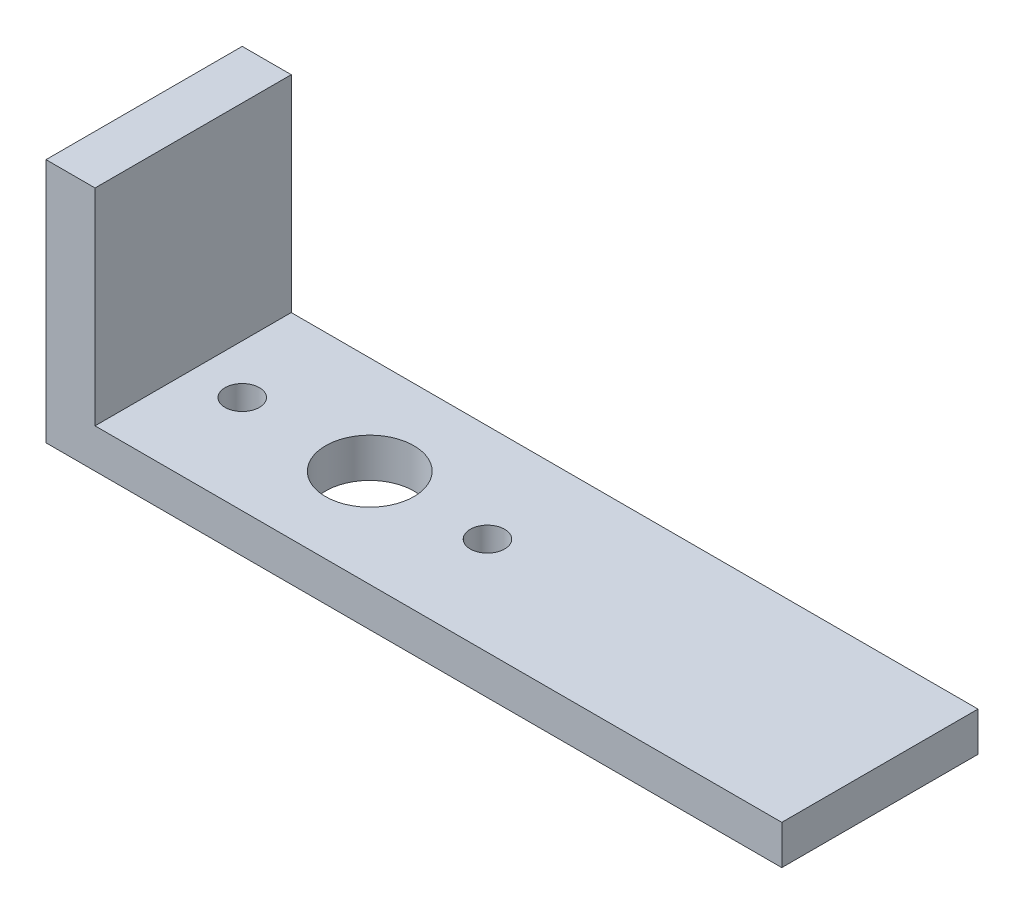
ISO-10303-21;
HEADER;
FILE_DESCRIPTION(('STEP AP214'),'2;1');
FILE_NAME('part.step','',(''),(''),'','','');
FILE_SCHEMA(('AUTOMOTIVE_DESIGN { 1 0 10303 214 1 1 1 1 }'));
ENDSEC;
DATA;
#1=APPLICATION_CONTEXT('core data for automotive mechanical design processes');
#2=APPLICATION_PROTOCOL_DEFINITION('international standard','automotive_design',2000,#1);
#3=PRODUCT_CONTEXT('',#1,'mechanical');
#4=PRODUCT('Part','Part','',(#3));
#5=PRODUCT_RELATED_PRODUCT_CATEGORY('part','',(#4));
#6=PRODUCT_DEFINITION_FORMATION('','',#4);
#7=PRODUCT_DEFINITION_CONTEXT('part definition',#1,'design');
#8=PRODUCT_DEFINITION('design','',#6,#7);
#9=PRODUCT_DEFINITION_SHAPE('','',#8);
#10=(LENGTH_UNIT() NAMED_UNIT(*) SI_UNIT(.MILLI.,.METRE.));
#11=(NAMED_UNIT(*) PLANE_ANGLE_UNIT() SI_UNIT($,.RADIAN.));
#12=(NAMED_UNIT(*) SI_UNIT($,.STERADIAN.) SOLID_ANGLE_UNIT());
#13=UNCERTAINTY_MEASURE_WITH_UNIT(LENGTH_MEASURE(1.E-05),#10,'distance_accuracy_value','');
#14=(GEOMETRIC_REPRESENTATION_CONTEXT(3) GLOBAL_UNCERTAINTY_ASSIGNED_CONTEXT((#13)) GLOBAL_UNIT_ASSIGNED_CONTEXT((#10,
#11,#12)) REPRESENTATION_CONTEXT('',''));
#15=CARTESIAN_POINT('',(0.,0.,0.));
#16=DIRECTION('',(0.,0.,1.));
#17=DIRECTION('',(1.,0.,0.));
#18=AXIS2_PLACEMENT_3D('',#15,#16,#17);
#19=CARTESIAN_POINT('',(0.,4.,-20.));
#20=DIRECTION('',(0.,0.,-1.));
#21=DIRECTION('',(-1.,0.,0.));
#22=AXIS2_PLACEMENT_3D('',#19,#20,#21);
#23=PLANE('',#22);
#24=DIRECTION('',(1.,0.,0.));
#25=VECTOR('',#24,1.);
#26=CARTESIAN_POINT('',(0.,0.,-20.));
#27=LINE('',#26,#25);
#28=CARTESIAN_POINT('',(0.,0.,-20.));
#29=VERTEX_POINT('',#28);
#30=CARTESIAN_POINT('',(75.,0.,-20.));
#31=VERTEX_POINT('',#30);
#32=EDGE_CURVE('E129',#29,#31,#27,.T.);
#33=ORIENTED_EDGE('',*,*,#32,.F.);
#34=DIRECTION('',(0.,-1.,0.));
#35=VECTOR('',#34,1.);
#36=CARTESIAN_POINT('',(0.,25.,-20.));
#37=LINE('',#36,#35);
#38=CARTESIAN_POINT('',(0.,25.,-20.));
#39=VERTEX_POINT('',#38);
#40=EDGE_CURVE('E204',#39,#29,#37,.T.);
#41=ORIENTED_EDGE('',*,*,#40,.F.);
#42=DIRECTION('',(1.,0.,0.));
#43=VECTOR('',#42,1.);
#44=CARTESIAN_POINT('',(0.,25.,-20.));
#45=LINE('',#44,#43);
#46=CARTESIAN_POINT('',(5.,25.,-20.));
#47=VERTEX_POINT('',#46);
#48=EDGE_CURVE('E200',#39,#47,#45,.T.);
#49=ORIENTED_EDGE('',*,*,#48,.T.);
#50=DIRECTION('',(0.,-1.,0.));
#51=VECTOR('',#50,1.);
#52=CARTESIAN_POINT('',(5.,25.,-20.));
#53=LINE('',#52,#51);
#54=CARTESIAN_POINT('',(5.,4.,-20.));
#55=VERTEX_POINT('',#54);
#56=EDGE_CURVE('E123',#47,#55,#53,.T.);
#57=ORIENTED_EDGE('',*,*,#56,.T.);
#58=DIRECTION('',(1.,0.,0.));
#59=VECTOR('',#58,1.);
#60=CARTESIAN_POINT('',(0.,4.,-20.));
#61=LINE('',#60,#59);
#62=CARTESIAN_POINT('',(75.,4.,-20.));
#63=VERTEX_POINT('',#62);
#64=EDGE_CURVE('E97',#55,#63,#61,.T.);
#65=ORIENTED_EDGE('',*,*,#64,.T.);
#66=DIRECTION('',(0.,-1.,0.));
#67=VECTOR('',#66,1.);
#68=CARTESIAN_POINT('',(75.,4.,-20.));
#69=LINE('',#68,#67);
#70=EDGE_CURVE('E47',#63,#31,#69,.T.);
#71=ORIENTED_EDGE('',*,*,#70,.T.);
#72=EDGE_LOOP('',(#33,#41,#49,#57,#65,#71));
#73=FACE_BOUND('',#72,.T.);
#74=ADVANCED_FACE('F37',(#73),#23,.T.);
#75=CARTESIAN_POINT('',(0.,4.,0.));
#76=DIRECTION('',(0.,0.,1.));
#77=DIRECTION('',(1.,0.,0.));
#78=AXIS2_PLACEMENT_3D('',#75,#76,#77);
#79=PLANE('',#78);
#80=DIRECTION('',(-1.,0.,0.));
#81=VECTOR('',#80,1.);
#82=CARTESIAN_POINT('',(0.,0.,0.));
#83=LINE('',#82,#81);
#84=CARTESIAN_POINT('',(75.,0.,0.));
#85=VERTEX_POINT('',#84);
#86=CARTESIAN_POINT('',(0.,0.,0.));
#87=VERTEX_POINT('',#86);
#88=EDGE_CURVE('E132',#85,#87,#83,.T.);
#89=ORIENTED_EDGE('',*,*,#88,.F.);
#90=DIRECTION('',(0.,-1.,0.));
#91=VECTOR('',#90,1.);
#92=CARTESIAN_POINT('',(75.,4.,0.));
#93=LINE('',#92,#91);
#94=CARTESIAN_POINT('',(75.,4.,0.));
#95=VERTEX_POINT('',#94);
#96=EDGE_CURVE('E11',#95,#85,#93,.T.);
#97=ORIENTED_EDGE('',*,*,#96,.F.);
#98=DIRECTION('',(-1.,0.,0.));
#99=VECTOR('',#98,1.);
#100=CARTESIAN_POINT('',(0.,4.,0.));
#101=LINE('',#100,#99);
#102=CARTESIAN_POINT('',(5.,4.,0.));
#103=VERTEX_POINT('',#102);
#104=EDGE_CURVE('E96',#95,#103,#101,.T.);
#105=ORIENTED_EDGE('',*,*,#104,.T.);
#106=DIRECTION('',(0.,-1.,0.));
#107=VECTOR('',#106,1.);
#108=CARTESIAN_POINT('',(5.,25.,0.));
#109=LINE('',#108,#107);
#110=CARTESIAN_POINT('',(5.,25.,0.));
#111=VERTEX_POINT('',#110);
#112=EDGE_CURVE('E80',#111,#103,#109,.T.);
#113=ORIENTED_EDGE('',*,*,#112,.F.);
#114=DIRECTION('',(-1.,0.,0.));
#115=VECTOR('',#114,1.);
#116=CARTESIAN_POINT('',(0.,25.,0.));
#117=LINE('',#116,#115);
#118=CARTESIAN_POINT('',(0.,25.,0.));
#119=VERTEX_POINT('',#118);
#120=EDGE_CURVE('E89',#111,#119,#117,.T.);
#121=ORIENTED_EDGE('',*,*,#120,.T.);
#122=DIRECTION('',(0.,-1.,0.));
#123=VECTOR('',#122,1.);
#124=CARTESIAN_POINT('',(0.,25.,0.));
#125=LINE('',#124,#123);
#126=EDGE_CURVE('E88',#119,#87,#125,.T.);
#127=ORIENTED_EDGE('',*,*,#126,.T.);
#128=EDGE_LOOP('',(#89,#97,#105,#113,#121,#127));
#129=FACE_BOUND('',#128,.T.);
#130=ADVANCED_FACE('F99',(#129),#79,.T.);
#131=CARTESIAN_POINT('',(10.,4.,-10.));
#132=DIRECTION('',(0.,-1.,0.));
#133=DIRECTION('',(0.,0.,-1.));
#134=AXIS2_PLACEMENT_3D('',#131,#132,#133);
#135=CYLINDRICAL_SURFACE('',#134,1.75);
#136=CARTESIAN_POINT('',(10.,4.,-10.));
#137=DIRECTION('',(0.,1.,0.));
#138=DIRECTION('',(0.,0.,1.));
#139=AXIS2_PLACEMENT_3D('',#136,#137,#138);
#140=CIRCLE('',#139,1.75);
#141=CARTESIAN_POINT('',(10.,4.,-8.25));
#142=VERTEX_POINT('',#141);
#143=EDGE_CURVE('E106',#142,#142,#140,.T.);
#144=ORIENTED_EDGE('',*,*,#143,.T.);
#145=EDGE_LOOP('',(#144));
#146=FACE_BOUND('',#145,.T.);
#147=CARTESIAN_POINT('',(10.,0.,-10.));
#148=DIRECTION('',(0.,1.,0.));
#149=DIRECTION('',(0.,0.,1.));
#150=AXIS2_PLACEMENT_3D('',#147,#148,#149);
#151=CIRCLE('',#150,1.75);
#152=CARTESIAN_POINT('',(10.,0.,-8.25));
#153=VERTEX_POINT('',#152);
#154=EDGE_CURVE('E126',#153,#153,#151,.T.);
#155=ORIENTED_EDGE('',*,*,#154,.F.);
#156=EDGE_LOOP('',(#155));
#157=FACE_BOUND('',#156,.T.);
#158=ADVANCED_FACE('F165',(#146,#157),#135,.F.);
#159=CARTESIAN_POINT('',(35.,4.,-10.));
#160=DIRECTION('',(0.,-1.,0.));
#161=DIRECTION('',(0.,0.,-1.));
#162=AXIS2_PLACEMENT_3D('',#159,#160,#161);
#163=CYLINDRICAL_SURFACE('',#162,1.75);
#164=CARTESIAN_POINT('',(35.,4.,-10.));
#165=DIRECTION('',(0.,1.,0.));
#166=DIRECTION('',(0.,0.,1.));
#167=AXIS2_PLACEMENT_3D('',#164,#165,#166);
#168=CIRCLE('',#167,1.75);
#169=CARTESIAN_POINT('',(35.,4.,-8.25));
#170=VERTEX_POINT('',#169);
#171=EDGE_CURVE('E109',#170,#170,#168,.T.);
#172=ORIENTED_EDGE('',*,*,#171,.T.);
#173=EDGE_LOOP('',(#172));
#174=FACE_BOUND('',#173,.T.);
#175=CARTESIAN_POINT('',(35.,0.,-10.));
#176=DIRECTION('',(0.,1.,0.));
#177=DIRECTION('',(0.,0.,1.));
#178=AXIS2_PLACEMENT_3D('',#175,#176,#177);
#179=CIRCLE('',#178,1.75);
#180=CARTESIAN_POINT('',(35.,0.,-8.25));
#181=VERTEX_POINT('',#180);
#182=EDGE_CURVE('E122',#181,#181,#179,.T.);
#183=ORIENTED_EDGE('',*,*,#182,.F.);
#184=EDGE_LOOP('',(#183));
#185=FACE_BOUND('',#184,.T.);
#186=ADVANCED_FACE('F156',(#174,#185),#163,.F.);
#187=CARTESIAN_POINT('',(23.,4.,-10.));
#188=DIRECTION('',(0.,-1.,0.));
#189=DIRECTION('',(0.,0.,-1.));
#190=AXIS2_PLACEMENT_3D('',#187,#188,#189);
#191=CYLINDRICAL_SURFACE('',#190,4.5);
#192=CARTESIAN_POINT('',(23.,4.,-10.));
#193=DIRECTION('',(0.,1.,0.));
#194=DIRECTION('',(0.,0.,1.));
#195=AXIS2_PLACEMENT_3D('',#192,#193,#194);
#196=CIRCLE('',#195,4.5);
#197=CARTESIAN_POINT('',(23.,4.,-5.5));
#198=VERTEX_POINT('',#197);
#199=EDGE_CURVE('E114',#198,#198,#196,.T.);
#200=ORIENTED_EDGE('',*,*,#199,.T.);
#201=EDGE_LOOP('',(#200));
#202=FACE_BOUND('',#201,.T.);
#203=CARTESIAN_POINT('',(23.,0.,-10.));
#204=DIRECTION('',(0.,1.,0.));
#205=DIRECTION('',(0.,0.,1.));
#206=AXIS2_PLACEMENT_3D('',#203,#204,#205);
#207=CIRCLE('',#206,4.5);
#208=CARTESIAN_POINT('',(23.,0.,-5.5));
#209=VERTEX_POINT('',#208);
#210=EDGE_CURVE('E119',#209,#209,#207,.T.);
#211=ORIENTED_EDGE('',*,*,#210,.F.);
#212=EDGE_LOOP('',(#211));
#213=FACE_BOUND('',#212,.T.);
#214=ADVANCED_FACE('F39',(#202,#213),#191,.F.);
#215=CARTESIAN_POINT('',(75.,4.,0.));
#216=DIRECTION('',(1.,0.,0.));
#217=DIRECTION('',(0.,0.,-1.));
#218=AXIS2_PLACEMENT_3D('',#215,#216,#217);
#219=PLANE('',#218);
#220=DIRECTION('',(0.,0.,1.));
#221=VECTOR('',#220,1.);
#222=CARTESIAN_POINT('',(75.,0.,0.));
#223=LINE('',#222,#221);
#224=EDGE_CURVE('E135',#31,#85,#223,.T.);
#225=ORIENTED_EDGE('',*,*,#224,.F.);
#226=ORIENTED_EDGE('',*,*,#70,.F.);
#227=DIRECTION('',(0.,0.,1.));
#228=VECTOR('',#227,1.);
#229=CARTESIAN_POINT('',(75.,4.,0.));
#230=LINE('',#229,#228);
#231=EDGE_CURVE('E100',#63,#95,#230,.T.);
#232=ORIENTED_EDGE('',*,*,#231,.T.);
#233=ORIENTED_EDGE('',*,*,#96,.T.);
#234=EDGE_LOOP('',(#225,#226,#232,#233));
#235=FACE_BOUND('',#234,.T.);
#236=ADVANCED_FACE('F147',(#235),#219,.T.);
#237=CARTESIAN_POINT('',(0.,4.,0.));
#238=DIRECTION('',(0.,1.,0.));
#239=DIRECTION('',(0.,0.,1.));
#240=AXIS2_PLACEMENT_3D('',#237,#238,#239);
#241=PLANE('',#240);
#242=ORIENTED_EDGE('',*,*,#199,.F.);
#243=EDGE_LOOP('',(#242));
#244=FACE_BOUND('',#243,.T.);
#245=ORIENTED_EDGE('',*,*,#171,.F.);
#246=EDGE_LOOP('',(#245));
#247=FACE_BOUND('',#246,.T.);
#248=ORIENTED_EDGE('',*,*,#143,.F.);
#249=EDGE_LOOP('',(#248));
#250=FACE_BOUND('',#249,.T.);
#251=ORIENTED_EDGE('',*,*,#64,.F.);
#252=DIRECTION('',(0.,0.,1.));
#253=VECTOR('',#252,1.);
#254=CARTESIAN_POINT('',(5.,4.,0.));
#255=LINE('',#254,#253);
#256=EDGE_CURVE('E71',#55,#103,#255,.T.);
#257=ORIENTED_EDGE('',*,*,#256,.T.);
#258=ORIENTED_EDGE('',*,*,#104,.F.);
#259=ORIENTED_EDGE('',*,*,#231,.F.);
#260=EDGE_LOOP('',(#251,#257,#258,#259));
#261=FACE_BOUND('',#260,.T.);
#262=ADVANCED_FACE('F94',(#244,#247,#250,#261),#241,.T.);
#263=CARTESIAN_POINT('',(0.,0.,0.));
#264=DIRECTION('',(0.,1.,0.));
#265=DIRECTION('',(0.,0.,1.));
#266=AXIS2_PLACEMENT_3D('',#263,#264,#265);
#267=PLANE('',#266);
#268=ORIENTED_EDGE('',*,*,#210,.T.);
#269=EDGE_LOOP('',(#268));
#270=FACE_BOUND('',#269,.T.);
#271=ORIENTED_EDGE('',*,*,#182,.T.);
#272=EDGE_LOOP('',(#271));
#273=FACE_BOUND('',#272,.T.);
#274=ORIENTED_EDGE('',*,*,#154,.T.);
#275=EDGE_LOOP('',(#274));
#276=FACE_BOUND('',#275,.T.);
#277=ORIENTED_EDGE('',*,*,#32,.T.);
#278=ORIENTED_EDGE('',*,*,#224,.T.);
#279=ORIENTED_EDGE('',*,*,#88,.T.);
#280=DIRECTION('',(0.,0.,-1.));
#281=VECTOR('',#280,1.);
#282=CARTESIAN_POINT('',(0.,0.,0.));
#283=LINE('',#282,#281);
#284=EDGE_CURVE('E146',#87,#29,#283,.T.);
#285=ORIENTED_EDGE('',*,*,#284,.T.);
#286=EDGE_LOOP('',(#277,#278,#279,#285));
#287=FACE_BOUND('',#286,.T.);
#288=ADVANCED_FACE('F144',(#270,#273,#276,#287),#267,.F.);
#289=CARTESIAN_POINT('',(5.,25.,0.));
#290=DIRECTION('',(1.,0.,0.));
#291=DIRECTION('',(0.,0.,-1.));
#292=AXIS2_PLACEMENT_3D('',#289,#290,#291);
#293=PLANE('',#292);
#294=ORIENTED_EDGE('',*,*,#256,.F.);
#295=ORIENTED_EDGE('',*,*,#56,.F.);
#296=DIRECTION('',(0.,0.,1.));
#297=VECTOR('',#296,1.);
#298=CARTESIAN_POINT('',(5.,25.,0.));
#299=LINE('',#298,#297);
#300=EDGE_CURVE('E83',#47,#111,#299,.T.);
#301=ORIENTED_EDGE('',*,*,#300,.T.);
#302=ORIENTED_EDGE('',*,*,#112,.T.);
#303=EDGE_LOOP('',(#294,#295,#301,#302));
#304=FACE_BOUND('',#303,.T.);
#305=ADVANCED_FACE('F81',(#304),#293,.T.);
#306=CARTESIAN_POINT('',(0.,25.,0.));
#307=DIRECTION('',(-1.,0.,0.));
#308=DIRECTION('',(0.,0.,1.));
#309=AXIS2_PLACEMENT_3D('',#306,#307,#308);
#310=PLANE('',#309);
#311=ORIENTED_EDGE('',*,*,#284,.F.);
#312=ORIENTED_EDGE('',*,*,#126,.F.);
#313=DIRECTION('',(0.,0.,-1.));
#314=VECTOR('',#313,1.);
#315=CARTESIAN_POINT('',(0.,25.,0.));
#316=LINE('',#315,#314);
#317=EDGE_CURVE('E205',#119,#39,#316,.T.);
#318=ORIENTED_EDGE('',*,*,#317,.T.);
#319=ORIENTED_EDGE('',*,*,#40,.T.);
#320=EDGE_LOOP('',(#311,#312,#318,#319));
#321=FACE_BOUND('',#320,.T.);
#322=ADVANCED_FACE('F184',(#321),#310,.T.);
#323=CARTESIAN_POINT('',(0.,25.,0.));
#324=DIRECTION('',(0.,1.,0.));
#325=DIRECTION('',(0.,0.,1.));
#326=AXIS2_PLACEMENT_3D('',#323,#324,#325);
#327=PLANE('',#326);
#328=ORIENTED_EDGE('',*,*,#300,.F.);
#329=ORIENTED_EDGE('',*,*,#48,.F.);
#330=ORIENTED_EDGE('',*,*,#317,.F.);
#331=ORIENTED_EDGE('',*,*,#120,.F.);
#332=EDGE_LOOP('',(#328,#329,#330,#331));
#333=FACE_BOUND('',#332,.T.);
#334=ADVANCED_FACE('F189',(#333),#327,.T.);
#335=CLOSED_SHELL('',(#74,#130,#158,#186,#214,#236,#262,#288,#305,#322,#334));
#336=MANIFOLD_SOLID_BREP('B2',#335);
#337=ADVANCED_BREP_SHAPE_REPRESENTATION('',(#18,#336),#14);
#338=SHAPE_DEFINITION_REPRESENTATION(#9,#337);
ENDSEC;
END-ISO-10303-21;
